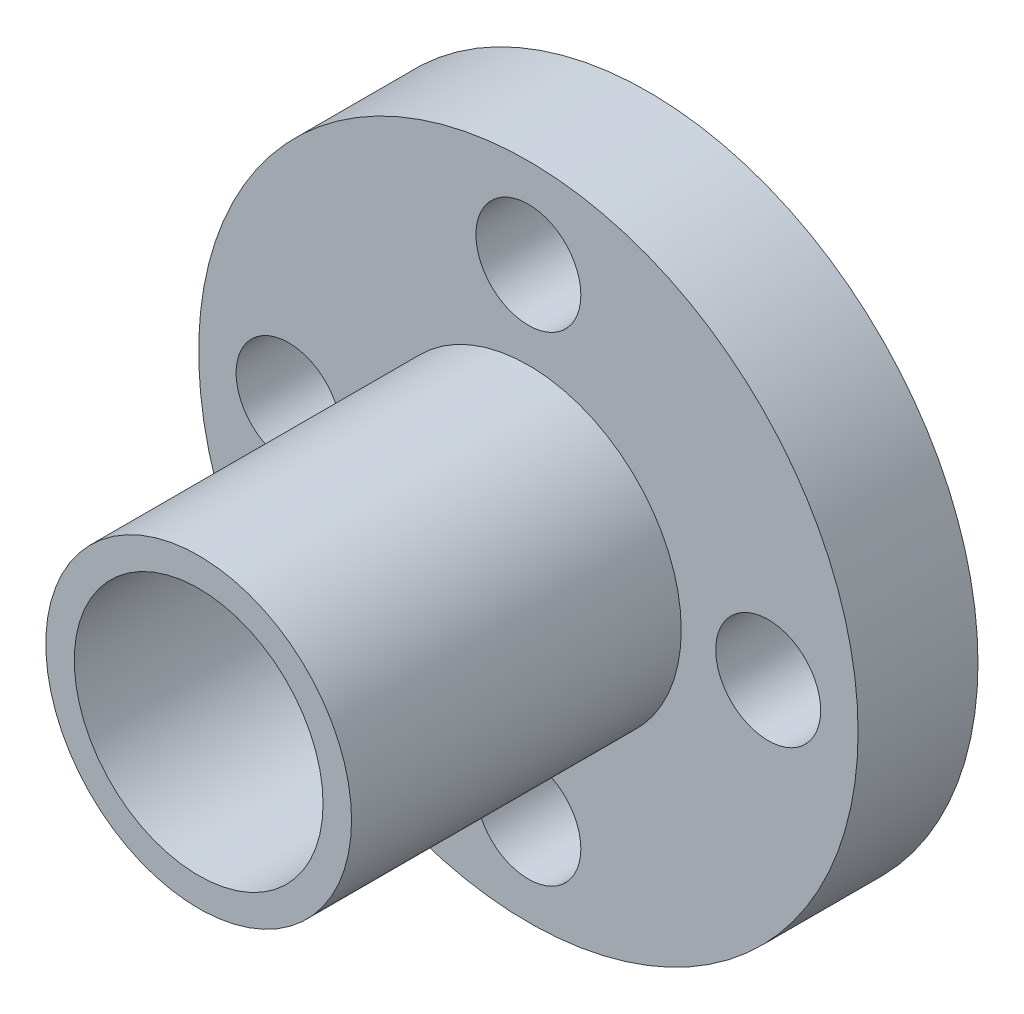
ISO-10303-21;
HEADER;
FILE_DESCRIPTION(('STEP AP214'),'2;1');
FILE_NAME('part.step','',(''),(''),'','','');
FILE_SCHEMA(('AUTOMOTIVE_DESIGN { 1 0 10303 214 1 1 1 1 }'));
ENDSEC;
DATA;
#1=APPLICATION_CONTEXT('core data for automotive mechanical design processes');
#2=APPLICATION_PROTOCOL_DEFINITION('international standard','automotive_design',2000,#1);
#3=PRODUCT_CONTEXT('',#1,'mechanical');
#4=PRODUCT('Part','Part','',(#3));
#5=PRODUCT_RELATED_PRODUCT_CATEGORY('part','',(#4));
#6=PRODUCT_DEFINITION_FORMATION('','',#4);
#7=PRODUCT_DEFINITION_CONTEXT('part definition',#1,'design');
#8=PRODUCT_DEFINITION('design','',#6,#7);
#9=PRODUCT_DEFINITION_SHAPE('','',#8);
#10=(LENGTH_UNIT() NAMED_UNIT(*) SI_UNIT(.MILLI.,.METRE.));
#11=(NAMED_UNIT(*) PLANE_ANGLE_UNIT() SI_UNIT($,.RADIAN.));
#12=(NAMED_UNIT(*) SI_UNIT($,.STERADIAN.) SOLID_ANGLE_UNIT());
#13=UNCERTAINTY_MEASURE_WITH_UNIT(LENGTH_MEASURE(1.E-05),#10,'distance_accuracy_value','');
#14=(GEOMETRIC_REPRESENTATION_CONTEXT(3) GLOBAL_UNCERTAINTY_ASSIGNED_CONTEXT((#13)) GLOBAL_UNIT_ASSIGNED_CONTEXT((#10,
#11,#12)) REPRESENTATION_CONTEXT('',''));
#15=CARTESIAN_POINT('',(0.,0.,0.));
#16=DIRECTION('',(0.,0.,1.));
#17=DIRECTION('',(1.,0.,0.));
#18=AXIS2_PLACEMENT_3D('',#15,#16,#17);
#19=CARTESIAN_POINT('',(0.,0.,15.));
#20=DIRECTION('',(0.,0.,1.));
#21=DIRECTION('',(1.,0.,0.));
#22=AXIS2_PLACEMENT_3D('',#19,#20,#21);
#23=PLANE('',#22);
#24=CARTESIAN_POINT('',(0.,0.,15.));
#25=DIRECTION('',(0.,0.,1.));
#26=DIRECTION('',(1.,0.,0.));
#27=AXIS2_PLACEMENT_3D('',#24,#25,#26);
#28=CIRCLE('',#27,4.15);
#29=CARTESIAN_POINT('',(4.15,0.,15.));
#30=VERTEX_POINT('',#29);
#31=EDGE_CURVE('E9',#30,#30,#28,.T.);
#32=ORIENTED_EDGE('',*,*,#31,.F.);
#33=EDGE_LOOP('',(#32));
#34=FACE_BOUND('',#33,.T.);
#35=CARTESIAN_POINT('',(0.,0.,15.));
#36=DIRECTION('',(0.,0.,1.));
#37=DIRECTION('',(1.,0.,0.));
#38=AXIS2_PLACEMENT_3D('',#35,#36,#37);
#39=CIRCLE('',#38,5.1);
#40=CARTESIAN_POINT('',(5.1,0.,15.));
#41=VERTEX_POINT('',#40);
#42=EDGE_CURVE('E21',#41,#41,#39,.T.);
#43=ORIENTED_EDGE('',*,*,#42,.T.);
#44=EDGE_LOOP('',(#43));
#45=FACE_BOUND('',#44,.T.);
#46=ADVANCED_FACE('F14',(#34,#45),#23,.T.);
#47=CARTESIAN_POINT('',(0.,0.,-1.));
#48=DIRECTION('',(0.,0.,1.));
#49=DIRECTION('',(1.,0.,0.));
#50=AXIS2_PLACEMENT_3D('',#47,#48,#49);
#51=CYLINDRICAL_SURFACE('',#50,4.15);
#52=ORIENTED_EDGE('',*,*,#31,.T.);
#53=EDGE_LOOP('',(#52));
#54=FACE_BOUND('',#53,.T.);
#55=CARTESIAN_POINT('',(0.,0.,0.));
#56=DIRECTION('',(0.,0.,1.));
#57=DIRECTION('',(1.,0.,0.));
#58=AXIS2_PLACEMENT_3D('',#55,#56,#57);
#59=CIRCLE('',#58,4.15);
#60=CARTESIAN_POINT('',(4.15,0.,0.));
#61=VERTEX_POINT('',#60);
#62=EDGE_CURVE('E39',#61,#61,#59,.T.);
#63=ORIENTED_EDGE('',*,*,#62,.F.);
#64=EDGE_LOOP('',(#63));
#65=FACE_BOUND('',#64,.T.);
#66=ADVANCED_FACE('F104',(#54,#65),#51,.F.);
#67=CARTESIAN_POINT('',(0.,8.,-1.));
#68=DIRECTION('',(0.,0.,1.));
#69=DIRECTION('',(1.,0.,0.));
#70=AXIS2_PLACEMENT_3D('',#67,#68,#69);
#71=CYLINDRICAL_SURFACE('',#70,1.75);
#72=CARTESIAN_POINT('',(0.,8.,4.));
#73=DIRECTION('',(0.,0.,1.));
#74=DIRECTION('',(1.,0.,0.));
#75=AXIS2_PLACEMENT_3D('',#72,#73,#74);
#76=CIRCLE('',#75,1.75);
#77=CARTESIAN_POINT('',(1.75,8.,4.));
#78=VERTEX_POINT('',#77);
#79=EDGE_CURVE('E46',#78,#78,#76,.T.);
#80=ORIENTED_EDGE('',*,*,#79,.T.);
#81=EDGE_LOOP('',(#80));
#82=FACE_BOUND('',#81,.T.);
#83=CARTESIAN_POINT('',(0.,8.,0.));
#84=DIRECTION('',(0.,0.,1.));
#85=DIRECTION('',(1.,0.,0.));
#86=AXIS2_PLACEMENT_3D('',#83,#84,#85);
#87=CIRCLE('',#86,1.75);
#88=CARTESIAN_POINT('',(1.75,8.,0.));
#89=VERTEX_POINT('',#88);
#90=EDGE_CURVE('E29',#89,#89,#87,.T.);
#91=ORIENTED_EDGE('',*,*,#90,.F.);
#92=EDGE_LOOP('',(#91));
#93=FACE_BOUND('',#92,.T.);
#94=ADVANCED_FACE('F109',(#82,#93),#71,.F.);
#95=CARTESIAN_POINT('',(8.,0.,-1.));
#96=DIRECTION('',(0.,0.,1.));
#97=DIRECTION('',(1.,0.,0.));
#98=AXIS2_PLACEMENT_3D('',#95,#96,#97);
#99=CYLINDRICAL_SURFACE('',#98,1.75);
#100=CARTESIAN_POINT('',(8.,0.,4.));
#101=DIRECTION('',(0.,0.,1.));
#102=DIRECTION('',(1.,0.,0.));
#103=AXIS2_PLACEMENT_3D('',#100,#101,#102);
#104=CIRCLE('',#103,1.75);
#105=CARTESIAN_POINT('',(9.75,0.,4.));
#106=VERTEX_POINT('',#105);
#107=EDGE_CURVE('E50',#106,#106,#104,.T.);
#108=ORIENTED_EDGE('',*,*,#107,.T.);
#109=EDGE_LOOP('',(#108));
#110=FACE_BOUND('',#109,.T.);
#111=CARTESIAN_POINT('',(8.,0.,0.));
#112=DIRECTION('',(0.,0.,1.));
#113=DIRECTION('',(1.,0.,0.));
#114=AXIS2_PLACEMENT_3D('',#111,#112,#113);
#115=CIRCLE('',#114,1.75);
#116=CARTESIAN_POINT('',(9.75,0.,0.));
#117=VERTEX_POINT('',#116);
#118=EDGE_CURVE('E36',#117,#117,#115,.T.);
#119=ORIENTED_EDGE('',*,*,#118,.F.);
#120=EDGE_LOOP('',(#119));
#121=FACE_BOUND('',#120,.T.);
#122=ADVANCED_FACE('F114',(#110,#121),#99,.F.);
#123=CARTESIAN_POINT('',(0.,0.,4.));
#124=DIRECTION('',(0.,0.,1.));
#125=DIRECTION('',(1.,0.,0.));
#126=AXIS2_PLACEMENT_3D('',#123,#124,#125);
#127=CYLINDRICAL_SURFACE('',#126,5.1);
#128=ORIENTED_EDGE('',*,*,#42,.F.);
#129=EDGE_LOOP('',(#128));
#130=FACE_BOUND('',#129,.T.);
#131=CARTESIAN_POINT('',(0.,0.,4.));
#132=DIRECTION('',(0.,0.,1.));
#133=DIRECTION('',(1.,0.,0.));
#134=AXIS2_PLACEMENT_3D('',#131,#132,#133);
#135=CIRCLE('',#134,5.1);
#136=CARTESIAN_POINT('',(5.1,0.,4.));
#137=VERTEX_POINT('',#136);
#138=EDGE_CURVE('E56',#137,#137,#135,.T.);
#139=ORIENTED_EDGE('',*,*,#138,.T.);
#140=EDGE_LOOP('',(#139));
#141=FACE_BOUND('',#140,.T.);
#142=ADVANCED_FACE('F99',(#130,#141),#127,.T.);
#143=CARTESIAN_POINT('',(-8.,0.,-1.));
#144=DIRECTION('',(0.,0.,1.));
#145=DIRECTION('',(1.,0.,0.));
#146=AXIS2_PLACEMENT_3D('',#143,#144,#145);
#147=CYLINDRICAL_SURFACE('',#146,1.75);
#148=CARTESIAN_POINT('',(-8.,0.,4.));
#149=DIRECTION('',(0.,0.,1.));
#150=DIRECTION('',(1.,0.,0.));
#151=AXIS2_PLACEMENT_3D('',#148,#149,#150);
#152=CIRCLE('',#151,1.75);
#153=CARTESIAN_POINT('',(-6.25,0.,4.));
#154=VERTEX_POINT('',#153);
#155=EDGE_CURVE('E52',#154,#154,#152,.T.);
#156=ORIENTED_EDGE('',*,*,#155,.T.);
#157=EDGE_LOOP('',(#156));
#158=FACE_BOUND('',#157,.T.);
#159=CARTESIAN_POINT('',(-8.,0.,0.));
#160=DIRECTION('',(0.,0.,1.));
#161=DIRECTION('',(1.,0.,0.));
#162=AXIS2_PLACEMENT_3D('',#159,#160,#161);
#163=CIRCLE('',#162,1.75);
#164=CARTESIAN_POINT('',(-6.25,0.,0.));
#165=VERTEX_POINT('',#164);
#166=EDGE_CURVE('E42',#165,#165,#163,.T.);
#167=ORIENTED_EDGE('',*,*,#166,.F.);
#168=EDGE_LOOP('',(#167));
#169=FACE_BOUND('',#168,.T.);
#170=ADVANCED_FACE('F88',(#158,#169),#147,.F.);
#171=CARTESIAN_POINT('',(0.,-8.,-1.));
#172=DIRECTION('',(0.,0.,1.));
#173=DIRECTION('',(1.,0.,0.));
#174=AXIS2_PLACEMENT_3D('',#171,#172,#173);
#175=CYLINDRICAL_SURFACE('',#174,1.75);
#176=CARTESIAN_POINT('',(0.,-8.,4.));
#177=DIRECTION('',(0.,0.,1.));
#178=DIRECTION('',(1.,0.,0.));
#179=AXIS2_PLACEMENT_3D('',#176,#177,#178);
#180=CIRCLE('',#179,1.75);
#181=CARTESIAN_POINT('',(1.75,-8.,4.));
#182=VERTEX_POINT('',#181);
#183=EDGE_CURVE('E57',#182,#182,#180,.T.);
#184=ORIENTED_EDGE('',*,*,#183,.T.);
#185=EDGE_LOOP('',(#184));
#186=FACE_BOUND('',#185,.T.);
#187=CARTESIAN_POINT('',(0.,-8.,0.));
#188=DIRECTION('',(0.,0.,1.));
#189=DIRECTION('',(1.,0.,0.));
#190=AXIS2_PLACEMENT_3D('',#187,#188,#189);
#191=CIRCLE('',#190,1.75);
#192=CARTESIAN_POINT('',(1.75,-8.,0.));
#193=VERTEX_POINT('',#192);
#194=EDGE_CURVE('E49',#193,#193,#191,.T.);
#195=ORIENTED_EDGE('',*,*,#194,.F.);
#196=EDGE_LOOP('',(#195));
#197=FACE_BOUND('',#196,.T.);
#198=ADVANCED_FACE('F86',(#186,#197),#175,.F.);
#199=CARTESIAN_POINT('',(0.,0.,0.));
#200=DIRECTION('',(0.,0.,1.));
#201=DIRECTION('',(1.,0.,0.));
#202=AXIS2_PLACEMENT_3D('',#199,#200,#201);
#203=PLANE('',#202);
#204=ORIENTED_EDGE('',*,*,#90,.T.);
#205=EDGE_LOOP('',(#204));
#206=FACE_BOUND('',#205,.T.);
#207=ORIENTED_EDGE('',*,*,#118,.T.);
#208=EDGE_LOOP('',(#207));
#209=FACE_BOUND('',#208,.T.);
#210=ORIENTED_EDGE('',*,*,#62,.T.);
#211=EDGE_LOOP('',(#210));
#212=FACE_BOUND('',#211,.T.);
#213=ORIENTED_EDGE('',*,*,#166,.T.);
#214=EDGE_LOOP('',(#213));
#215=FACE_BOUND('',#214,.T.);
#216=ORIENTED_EDGE('',*,*,#194,.T.);
#217=EDGE_LOOP('',(#216));
#218=FACE_BOUND('',#217,.T.);
#219=CARTESIAN_POINT('',(0.,0.,0.));
#220=DIRECTION('',(0.,0.,1.));
#221=DIRECTION('',(1.,0.,0.));
#222=AXIS2_PLACEMENT_3D('',#219,#220,#221);
#223=CIRCLE('',#222,11.);
#224=CARTESIAN_POINT('',(11.,0.,0.));
#225=VERTEX_POINT('',#224);
#226=EDGE_CURVE('E64',#225,#225,#223,.T.);
#227=ORIENTED_EDGE('',*,*,#226,.F.);
#228=EDGE_LOOP('',(#227));
#229=FACE_BOUND('',#228,.T.);
#230=ADVANCED_FACE('F83',(#206,#209,#212,#215,#218,#229),#203,.F.);
#231=CARTESIAN_POINT('',(0.,0.,4.));
#232=DIRECTION('',(0.,0.,1.));
#233=DIRECTION('',(1.,0.,0.));
#234=AXIS2_PLACEMENT_3D('',#231,#232,#233);
#235=PLANE('',#234);
#236=ORIENTED_EDGE('',*,*,#79,.F.);
#237=EDGE_LOOP('',(#236));
#238=FACE_BOUND('',#237,.T.);
#239=ORIENTED_EDGE('',*,*,#107,.F.);
#240=EDGE_LOOP('',(#239));
#241=FACE_BOUND('',#240,.T.);
#242=ORIENTED_EDGE('',*,*,#138,.F.);
#243=EDGE_LOOP('',(#242));
#244=FACE_BOUND('',#243,.T.);
#245=ORIENTED_EDGE('',*,*,#155,.F.);
#246=EDGE_LOOP('',(#245));
#247=FACE_BOUND('',#246,.T.);
#248=ORIENTED_EDGE('',*,*,#183,.F.);
#249=EDGE_LOOP('',(#248));
#250=FACE_BOUND('',#249,.T.);
#251=CARTESIAN_POINT('',(0.,0.,4.));
#252=DIRECTION('',(0.,0.,1.));
#253=DIRECTION('',(1.,0.,0.));
#254=AXIS2_PLACEMENT_3D('',#251,#252,#253);
#255=CIRCLE('',#254,11.);
#256=CARTESIAN_POINT('',(11.,0.,4.));
#257=VERTEX_POINT('',#256);
#258=EDGE_CURVE('E74',#257,#257,#255,.T.);
#259=ORIENTED_EDGE('',*,*,#258,.T.);
#260=EDGE_LOOP('',(#259));
#261=FACE_BOUND('',#260,.T.);
#262=ADVANCED_FACE('F96',(#238,#241,#244,#247,#250,#261),#235,.T.);
#263=CARTESIAN_POINT('',(0.,0.,0.));
#264=DIRECTION('',(0.,0.,1.));
#265=DIRECTION('',(1.,0.,0.));
#266=AXIS2_PLACEMENT_3D('',#263,#264,#265);
#267=CYLINDRICAL_SURFACE('',#266,11.);
#268=ORIENTED_EDGE('',*,*,#258,.F.);
#269=EDGE_LOOP('',(#268));
#270=FACE_BOUND('',#269,.T.);
#271=ORIENTED_EDGE('',*,*,#226,.T.);
#272=EDGE_LOOP('',(#271));
#273=FACE_BOUND('',#272,.T.);
#274=ADVANCED_FACE('F130',(#270,#273),#267,.T.);
#275=CLOSED_SHELL('',(#46,#66,#94,#122,#142,#170,#198,#230,#262,#274));
#276=MANIFOLD_SOLID_BREP('B1',#275);
#277=ADVANCED_BREP_SHAPE_REPRESENTATION('',(#18,#276),#14);
#278=SHAPE_DEFINITION_REPRESENTATION(#9,#277);
ENDSEC;
END-ISO-10303-21;
